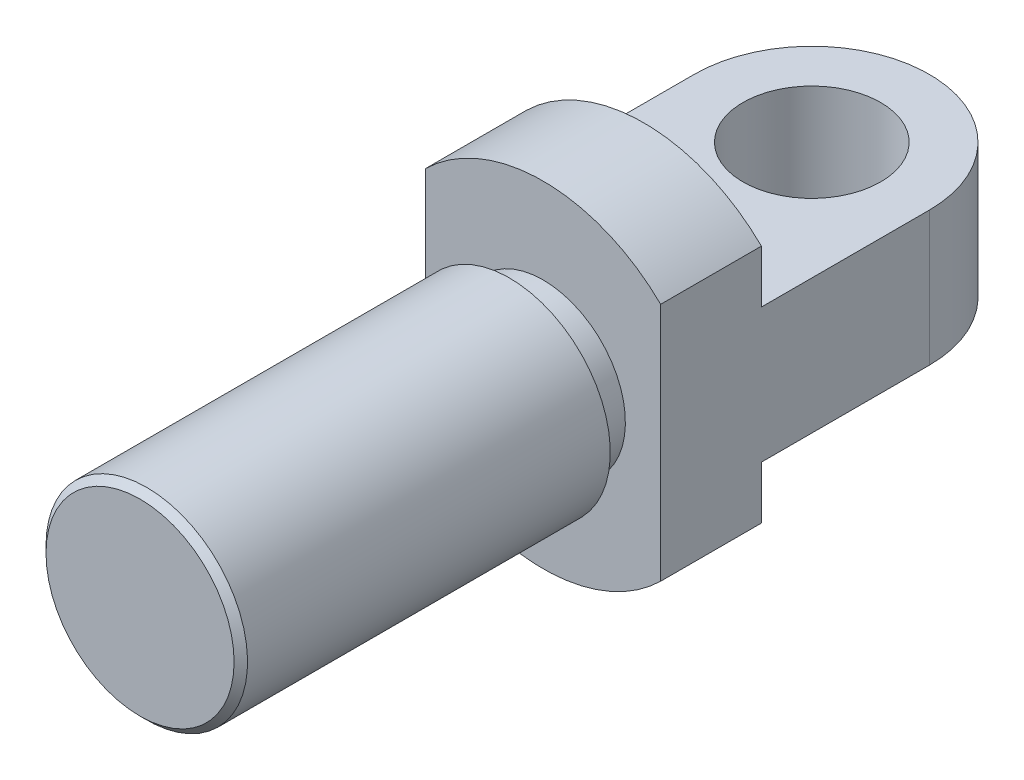
ISO-10303-21;
HEADER;
FILE_DESCRIPTION(('STEP AP214'),'2;1');
FILE_NAME('part.step','',(''),(''),'','','');
FILE_SCHEMA(('AUTOMOTIVE_DESIGN { 1 0 10303 214 1 1 1 1 }'));
ENDSEC;
DATA;
#1=APPLICATION_CONTEXT('core data for automotive mechanical design processes');
#2=APPLICATION_PROTOCOL_DEFINITION('international standard','automotive_design',2000,#1);
#3=PRODUCT_CONTEXT('',#1,'mechanical');
#4=PRODUCT('Part','Part','',(#3));
#5=PRODUCT_RELATED_PRODUCT_CATEGORY('part','',(#4));
#6=PRODUCT_DEFINITION_FORMATION('','',#4);
#7=PRODUCT_DEFINITION_CONTEXT('part definition',#1,'design');
#8=PRODUCT_DEFINITION('design','',#6,#7);
#9=PRODUCT_DEFINITION_SHAPE('','',#8);
#10=(LENGTH_UNIT() NAMED_UNIT(*) SI_UNIT(.MILLI.,.METRE.));
#11=(NAMED_UNIT(*) PLANE_ANGLE_UNIT() SI_UNIT($,.RADIAN.));
#12=(NAMED_UNIT(*) SI_UNIT($,.STERADIAN.) SOLID_ANGLE_UNIT());
#13=UNCERTAINTY_MEASURE_WITH_UNIT(LENGTH_MEASURE(1.E-05),#10,'distance_accuracy_value','');
#14=(GEOMETRIC_REPRESENTATION_CONTEXT(3) GLOBAL_UNCERTAINTY_ASSIGNED_CONTEXT((#13)) GLOBAL_UNIT_ASSIGNED_CONTEXT((#10,
#11,#12)) REPRESENTATION_CONTEXT('',''));
#15=CARTESIAN_POINT('',(0.,0.,0.));
#16=DIRECTION('',(0.,0.,1.));
#17=DIRECTION('',(1.,0.,0.));
#18=AXIS2_PLACEMENT_3D('',#15,#16,#17);
#19=CARTESIAN_POINT('',(0.,-2.,-5.));
#20=DIRECTION('',(0.,-1.,0.));
#21=DIRECTION('',(0.,0.,-1.));
#22=AXIS2_PLACEMENT_3D('',#19,#20,#21);
#23=CYLINDRICAL_SURFACE('',#22,3.5);
#24=CARTESIAN_POINT('',(0.,-2.,-5.));
#25=DIRECTION('',(0.,-1.,0.));
#26=DIRECTION('',(-1.,0.,0.));
#27=AXIS2_PLACEMENT_3D('',#24,#25,#26);
#28=CIRCLE('',#27,3.5);
#29=CARTESIAN_POINT('',(-3.5,-2.,-5.));
#30=VERTEX_POINT('',#29);
#31=CARTESIAN_POINT('',(3.5,-2.,-5.));
#32=VERTEX_POINT('',#31);
#33=EDGE_CURVE('E136',#30,#32,#28,.T.);
#34=ORIENTED_EDGE('',*,*,#33,.F.);
#35=DIRECTION('',(0.,-1.,0.));
#36=VECTOR('',#35,1.);
#37=CARTESIAN_POINT('',(-3.5,2.,-5.));
#38=LINE('',#37,#36);
#39=CARTESIAN_POINT('',(-3.5,2.,-5.));
#40=VERTEX_POINT('',#39);
#41=EDGE_CURVE('E187',#40,#30,#38,.T.);
#42=ORIENTED_EDGE('',*,*,#41,.F.);
#43=CARTESIAN_POINT('',(0.,2.,-5.));
#44=DIRECTION('',(0.,-1.,0.));
#45=DIRECTION('',(-1.,0.,0.));
#46=AXIS2_PLACEMENT_3D('',#43,#44,#45);
#47=CIRCLE('',#46,3.5);
#48=CARTESIAN_POINT('',(3.5,2.,-5.));
#49=VERTEX_POINT('',#48);
#50=EDGE_CURVE('E21',#40,#49,#47,.T.);
#51=ORIENTED_EDGE('',*,*,#50,.T.);
#52=DIRECTION('',(0.,-1.,0.));
#53=VECTOR('',#52,1.);
#54=CARTESIAN_POINT('',(3.5,2.,-5.));
#55=LINE('',#54,#53);
#56=EDGE_CURVE('E208',#49,#32,#55,.T.);
#57=ORIENTED_EDGE('',*,*,#56,.T.);
#58=EDGE_LOOP('',(#34,#42,#51,#57));
#59=FACE_BOUND('',#58,.T.);
#60=ADVANCED_FACE('F17',(#59),#23,.T.);
#61=CARTESIAN_POINT('',(0.,0.,0.));
#62=DIRECTION('',(0.,0.,1.));
#63=DIRECTION('',(1.,0.,0.));
#64=AXIS2_PLACEMENT_3D('',#61,#62,#63);
#65=CYLINDRICAL_SURFACE('',#64,5.);
#66=DIRECTION('',(0.,0.,1.));
#67=VECTOR('',#66,1.);
#68=CARTESIAN_POINT('',(-3.5,3.570714214271,0.));
#69=LINE('',#68,#67);
#70=CARTESIAN_POINT('',(-3.5,3.570714214271,0.));
#71=VERTEX_POINT('',#70);
#72=CARTESIAN_POINT('',(-3.5,3.570714214271,3.));
#73=VERTEX_POINT('',#72);
#74=EDGE_CURVE('E196',#71,#73,#69,.T.);
#75=ORIENTED_EDGE('',*,*,#74,.T.);
#76=CARTESIAN_POINT('',(0.,0.,3.));
#77=DIRECTION('',(0.,0.,1.));
#78=DIRECTION('',(0.7,0.714142842854292,0.));
#79=AXIS2_PLACEMENT_3D('',#76,#77,#78);
#80=CIRCLE('',#79,5.);
#81=CARTESIAN_POINT('',(3.5,3.570714214271,3.));
#82=VERTEX_POINT('',#81);
#83=EDGE_CURVE('E152',#82,#73,#80,.T.);
#84=ORIENTED_EDGE('',*,*,#83,.F.);
#85=DIRECTION('',(0.,0.,1.));
#86=VECTOR('',#85,1.);
#87=CARTESIAN_POINT('',(3.5,3.570714214271,0.));
#88=LINE('',#87,#86);
#89=CARTESIAN_POINT('',(3.5,3.570714214271,0.));
#90=VERTEX_POINT('',#89);
#91=EDGE_CURVE('E266',#90,#82,#88,.T.);
#92=ORIENTED_EDGE('',*,*,#91,.F.);
#93=CARTESIAN_POINT('',(0.,0.,0.));
#94=DIRECTION('',(0.,0.,1.));
#95=DIRECTION('',(0.7,0.714142842854292,0.));
#96=AXIS2_PLACEMENT_3D('',#93,#94,#95);
#97=CIRCLE('',#96,5.);
#98=EDGE_CURVE('E253',#90,#71,#97,.T.);
#99=ORIENTED_EDGE('',*,*,#98,.T.);
#100=EDGE_LOOP('',(#75,#84,#92,#99));
#101=FACE_BOUND('',#100,.T.);
#102=ADVANCED_FACE('F309',(#101),#65,.T.);
#103=CARTESIAN_POINT('',(0.,0.,15.));
#104=DIRECTION('',(0.,0.,1.));
#105=DIRECTION('',(1.,0.,0.));
#106=AXIS2_PLACEMENT_3D('',#103,#104,#105);
#107=PLANE('',#106);
#108=CARTESIAN_POINT('',(0.,0.,15.));
#109=DIRECTION('',(0.,0.,1.));
#110=DIRECTION('',(-1.,0.,0.));
#111=AXIS2_PLACEMENT_3D('',#108,#109,#110);
#112=CIRCLE('',#111,2.8);
#113=CARTESIAN_POINT('',(0.,2.8000000000015,15.0000000000015));
#114=VERTEX_POINT('',#113);
#115=EDGE_CURVE('E11',#114,#114,#112,.T.);
#116=ORIENTED_EDGE('',*,*,#115,.T.);
#117=EDGE_LOOP('',(#116));
#118=FACE_BOUND('',#117,.T.);
#119=ADVANCED_FACE('F357',(#118),#107,.T.);
#120=CARTESIAN_POINT('',(0.,0.,14.90000000011));
#121=DIRECTION('',(0.,0.,-1.));
#122=DIRECTION('',(0.,-1.,0.));
#123=AXIS2_PLACEMENT_3D('',#120,#121,#122);
#124=CONICAL_SURFACE('',#123,2.899999999893,0.785398163397448);
#125=CARTESIAN_POINT('',(0.,0.,14.8));
#126=DIRECTION('',(0.,0.,1.));
#127=DIRECTION('',(1.,0.,0.));
#128=AXIS2_PLACEMENT_3D('',#125,#126,#127);
#129=CIRCLE('',#128,3.);
#130=CARTESIAN_POINT('',(-3.,0.,14.8));
#131=VERTEX_POINT('',#130);
#132=CARTESIAN_POINT('',(0.,3.0000000000015,14.8000000000015));
#133=VERTEX_POINT('',#132);
#134=EDGE_CURVE('E163',#131,#133,#129,.T.);
#135=ORIENTED_EDGE('',*,*,#134,.T.);
#136=DIRECTION('',(0.,-0.707106781186548,0.707106781186548));
#137=VECTOR('',#136,1.);
#138=CARTESIAN_POINT('',(0.,2.899999999893,14.90000000011));
#139=LINE('',#138,#137);
#140=EDGE_CURVE('E28',#133,#114,#139,.T.);
#141=ORIENTED_EDGE('',*,*,#140,.T.);
#142=ORIENTED_EDGE('',*,*,#115,.F.);
#143=ORIENTED_EDGE('',*,*,#140,.F.);
#144=CARTESIAN_POINT('',(0.,0.,14.8));
#145=DIRECTION('',(0.,0.,1.));
#146=DIRECTION('',(1.,0.,0.));
#147=AXIS2_PLACEMENT_3D('',#144,#145,#146);
#148=CIRCLE('',#147,3.);
#149=EDGE_CURVE('E181',#133,#131,#148,.T.);
#150=ORIENTED_EDGE('',*,*,#149,.T.);
#151=EDGE_LOOP('',(#135,#141,#142,#143,#150));
#152=FACE_BOUND('',#151,.T.);
#153=ADVANCED_FACE('F385',(#152),#124,.T.);
#154=CARTESIAN_POINT('',(0.,0.,3.));
#155=DIRECTION('',(0.,0.,1.));
#156=DIRECTION('',(1.,0.,0.));
#157=AXIS2_PLACEMENT_3D('',#154,#155,#156);
#158=CYLINDRICAL_SURFACE('',#157,3.);
#159=ORIENTED_EDGE('',*,*,#134,.F.);
#160=DIRECTION('',(0.,0.,-1.));
#161=VECTOR('',#160,1.);
#162=CARTESIAN_POINT('',(-3.,0.,3.));
#163=LINE('',#162,#161);
#164=CARTESIAN_POINT('',(-3.,0.,4.));
#165=VERTEX_POINT('',#164);
#166=EDGE_CURVE('E229',#131,#165,#163,.T.);
#167=ORIENTED_EDGE('',*,*,#166,.T.);
#168=CARTESIAN_POINT('',(0.,0.,4.));
#169=DIRECTION('',(0.,0.,-1.));
#170=DIRECTION('',(-1.,0.,0.));
#171=AXIS2_PLACEMENT_3D('',#168,#169,#170);
#172=CIRCLE('',#171,3.);
#173=EDGE_CURVE('E157',#165,#165,#172,.T.);
#174=ORIENTED_EDGE('',*,*,#173,.F.);
#175=ORIENTED_EDGE('',*,*,#166,.F.);
#176=ORIENTED_EDGE('',*,*,#149,.F.);
#177=EDGE_LOOP('',(#159,#167,#174,#175,#176));
#178=FACE_BOUND('',#177,.T.);
#179=ADVANCED_FACE('F375',(#178),#158,.T.);
#180=CARTESIAN_POINT('',(0.,0.,4.));
#181=DIRECTION('',(0.,0.,-1.));
#182=DIRECTION('',(0.,-1.,0.));
#183=AXIS2_PLACEMENT_3D('',#180,#181,#182);
#184=PLANE('',#183);
#185=CARTESIAN_POINT('',(0.,0.,4.));
#186=DIRECTION('',(0.,0.,-1.));
#187=DIRECTION('',(0.,1.,0.));
#188=AXIS2_PLACEMENT_3D('',#185,#186,#187);
#189=CIRCLE('',#188,2.45);
#190=CARTESIAN_POINT('',(0.,2.45,4.));
#191=VERTEX_POINT('',#190);
#192=EDGE_CURVE('E95',#191,#191,#189,.T.);
#193=ORIENTED_EDGE('',*,*,#192,.F.);
#194=EDGE_LOOP('',(#193));
#195=FACE_BOUND('',#194,.T.);
#196=ORIENTED_EDGE('',*,*,#173,.T.);
#197=EDGE_LOOP('',(#196));
#198=FACE_BOUND('',#197,.T.);
#199=ADVANCED_FACE('F369',(#195,#198),#184,.T.);
#200=CARTESIAN_POINT('',(0.,0.,4.05));
#201=DIRECTION('',(0.,0.,-1.));
#202=DIRECTION('',(0.,-1.,0.));
#203=AXIS2_PLACEMENT_3D('',#200,#201,#202);
#204=CYLINDRICAL_SURFACE('',#203,2.45);
#205=CARTESIAN_POINT('',(0.,0.,3.));
#206=DIRECTION('',(0.,0.,1.));
#207=DIRECTION('',(0.,1.,0.));
#208=AXIS2_PLACEMENT_3D('',#205,#206,#207);
#209=CIRCLE('',#208,2.45);
#210=CARTESIAN_POINT('',(0.,2.45,3.));
#211=VERTEX_POINT('',#210);
#212=EDGE_CURVE('E150',#211,#211,#209,.T.);
#213=ORIENTED_EDGE('',*,*,#212,.T.);
#214=DIRECTION('',(0.,0.,1.));
#215=VECTOR('',#214,1.);
#216=CARTESIAN_POINT('',(0.,2.45,4.05));
#217=LINE('',#216,#215);
#218=EDGE_CURVE('E103',#211,#191,#217,.T.);
#219=ORIENTED_EDGE('',*,*,#218,.T.);
#220=ORIENTED_EDGE('',*,*,#192,.T.);
#221=ORIENTED_EDGE('',*,*,#218,.F.);
#222=EDGE_LOOP('',(#213,#219,#220,#221));
#223=FACE_BOUND('',#222,.T.);
#224=ADVANCED_FACE('F374',(#223),#204,.T.);
#225=CARTESIAN_POINT('',(0.,0.,3.));
#226=DIRECTION('',(0.,0.,1.));
#227=DIRECTION('',(1.,0.,0.));
#228=AXIS2_PLACEMENT_3D('',#225,#226,#227);
#229=PLANE('',#228);
#230=ORIENTED_EDGE('',*,*,#212,.F.);
#231=EDGE_LOOP('',(#230));
#232=FACE_BOUND('',#231,.T.);
#233=DIRECTION('',(0.,-1.,0.));
#234=VECTOR('',#233,1.);
#235=CARTESIAN_POINT('',(-3.5,3.570714214271,3.));
#236=LINE('',#235,#234);
#237=CARTESIAN_POINT('',(-3.5,-3.570714214271,3.));
#238=VERTEX_POINT('',#237);
#239=EDGE_CURVE('E200',#73,#238,#236,.T.);
#240=ORIENTED_EDGE('',*,*,#239,.T.);
#241=CARTESIAN_POINT('',(0.,0.,3.));
#242=DIRECTION('',(0.,0.,1.));
#243=DIRECTION('',(-0.7,-0.714142842854292,0.));
#244=AXIS2_PLACEMENT_3D('',#241,#242,#243);
#245=CIRCLE('',#244,5.);
#246=CARTESIAN_POINT('',(3.5,-3.570714214271,3.));
#247=VERTEX_POINT('',#246);
#248=EDGE_CURVE('E172',#238,#247,#245,.T.);
#249=ORIENTED_EDGE('',*,*,#248,.T.);
#250=DIRECTION('',(0.,1.,0.));
#251=VECTOR('',#250,1.);
#252=CARTESIAN_POINT('',(3.5,-3.570714214271,3.));
#253=LINE('',#252,#251);
#254=EDGE_CURVE('E263',#247,#82,#253,.T.);
#255=ORIENTED_EDGE('',*,*,#254,.T.);
#256=ORIENTED_EDGE('',*,*,#83,.T.);
#257=EDGE_LOOP('',(#240,#249,#255,#256));
#258=FACE_BOUND('',#257,.T.);
#259=ADVANCED_FACE('F307',(#232,#258),#229,.T.);
#260=CARTESIAN_POINT('',(0.,0.,0.));
#261=DIRECTION('',(0.,0.,1.));
#262=DIRECTION('',(1.,0.,0.));
#263=AXIS2_PLACEMENT_3D('',#260,#261,#262);
#264=CYLINDRICAL_SURFACE('',#263,5.);
#265=DIRECTION('',(0.,0.,1.));
#266=VECTOR('',#265,1.);
#267=CARTESIAN_POINT('',(-3.5,-3.570714214271,0.));
#268=LINE('',#267,#266);
#269=CARTESIAN_POINT('',(-3.5,-3.570714214271,0.));
#270=VERTEX_POINT('',#269);
#271=EDGE_CURVE('E186',#270,#238,#268,.T.);
#272=ORIENTED_EDGE('',*,*,#271,.F.);
#273=CARTESIAN_POINT('',(0.,0.,0.));
#274=DIRECTION('',(0.,0.,1.));
#275=DIRECTION('',(-0.7,-0.714142842854292,0.));
#276=AXIS2_PLACEMENT_3D('',#273,#274,#275);
#277=CIRCLE('',#276,5.);
#278=CARTESIAN_POINT('',(3.5,-3.570714214271,0.));
#279=VERTEX_POINT('',#278);
#280=EDGE_CURVE('E249',#270,#279,#277,.T.);
#281=ORIENTED_EDGE('',*,*,#280,.T.);
#282=DIRECTION('',(0.,0.,1.));
#283=VECTOR('',#282,1.);
#284=CARTESIAN_POINT('',(3.5,-3.570714214271,0.));
#285=LINE('',#284,#283);
#286=EDGE_CURVE('E195',#279,#247,#285,.T.);
#287=ORIENTED_EDGE('',*,*,#286,.T.);
#288=ORIENTED_EDGE('',*,*,#248,.F.);
#289=EDGE_LOOP('',(#272,#281,#287,#288));
#290=FACE_BOUND('',#289,.T.);
#291=ADVANCED_FACE('F305',(#290),#264,.T.);
#292=CARTESIAN_POINT('',(3.5,2.,0.));
#293=DIRECTION('',(1.,0.,0.));
#294=DIRECTION('',(0.,1.,0.));
#295=AXIS2_PLACEMENT_3D('',#292,#293,#294);
#296=PLANE('',#295);
#297=DIRECTION('',(0.,0.,-1.));
#298=VECTOR('',#297,1.);
#299=CARTESIAN_POINT('',(3.5,-2.,0.));
#300=LINE('',#299,#298);
#301=CARTESIAN_POINT('',(3.5,-2.,0.));
#302=VERTEX_POINT('',#301);
#303=EDGE_CURVE('E144',#302,#32,#300,.T.);
#304=ORIENTED_EDGE('',*,*,#303,.T.);
#305=ORIENTED_EDGE('',*,*,#56,.F.);
#306=DIRECTION('',(0.,0.,-1.));
#307=VECTOR('',#306,1.);
#308=CARTESIAN_POINT('',(3.5,2.,0.));
#309=LINE('',#308,#307);
#310=CARTESIAN_POINT('',(3.5,2.,0.));
#311=VERTEX_POINT('',#310);
#312=EDGE_CURVE('E199',#311,#49,#309,.T.);
#313=ORIENTED_EDGE('',*,*,#312,.F.);
#314=DIRECTION('',(0.,1.,0.));
#315=VECTOR('',#314,1.);
#316=CARTESIAN_POINT('',(3.5,2.,0.));
#317=LINE('',#316,#315);
#318=EDGE_CURVE('E167',#311,#90,#317,.T.);
#319=ORIENTED_EDGE('',*,*,#318,.T.);
#320=ORIENTED_EDGE('',*,*,#91,.T.);
#321=ORIENTED_EDGE('',*,*,#254,.F.);
#322=ORIENTED_EDGE('',*,*,#286,.F.);
#323=DIRECTION('',(0.,1.,0.));
#324=VECTOR('',#323,1.);
#325=CARTESIAN_POINT('',(3.5,-3.570714214271,0.));
#326=LINE('',#325,#324);
#327=EDGE_CURVE('E245',#279,#302,#326,.T.);
#328=ORIENTED_EDGE('',*,*,#327,.T.);
#329=EDGE_LOOP('',(#304,#305,#313,#319,#320,#321,#322,#328));
#330=FACE_BOUND('',#329,.T.);
#331=ADVANCED_FACE('F19',(#330),#296,.T.);
#332=CARTESIAN_POINT('',(3.5,-2.,0.));
#333=DIRECTION('',(0.,-1.,0.));
#334=DIRECTION('',(0.,0.,-1.));
#335=AXIS2_PLACEMENT_3D('',#332,#333,#334);
#336=PLANE('',#335);
#337=CARTESIAN_POINT('',(0.,-2.,-5.));
#338=DIRECTION('',(0.,1.,0.));
#339=DIRECTION('',(-1.,0.,0.));
#340=AXIS2_PLACEMENT_3D('',#337,#338,#339);
#341=CIRCLE('',#340,2.05);
#342=CARTESIAN_POINT('',(2.05,-2.,-5.));
#343=VERTEX_POINT('',#342);
#344=EDGE_CURVE('E134',#343,#343,#341,.T.);
#345=ORIENTED_EDGE('',*,*,#344,.T.);
#346=EDGE_LOOP('',(#345));
#347=FACE_BOUND('',#346,.T.);
#348=DIRECTION('',(-1.,0.,0.));
#349=VECTOR('',#348,1.);
#350=CARTESIAN_POINT('',(3.5,-2.,0.));
#351=LINE('',#350,#349);
#352=CARTESIAN_POINT('',(-3.5,-2.,0.));
#353=VERTEX_POINT('',#352);
#354=EDGE_CURVE('E177',#302,#353,#351,.T.);
#355=ORIENTED_EDGE('',*,*,#354,.T.);
#356=DIRECTION('',(0.,0.,-1.));
#357=VECTOR('',#356,1.);
#358=CARTESIAN_POINT('',(-3.5,-2.,0.));
#359=LINE('',#358,#357);
#360=EDGE_CURVE('E182',#353,#30,#359,.T.);
#361=ORIENTED_EDGE('',*,*,#360,.T.);
#362=ORIENTED_EDGE('',*,*,#33,.T.);
#363=ORIENTED_EDGE('',*,*,#303,.F.);
#364=EDGE_LOOP('',(#355,#361,#362,#363));
#365=FACE_BOUND('',#364,.T.);
#366=ADVANCED_FACE('F296',(#347,#365),#336,.T.);
#367=CARTESIAN_POINT('',(0.,-2.,-5.));
#368=DIRECTION('',(0.,1.,0.));
#369=DIRECTION('',(-1.,0.,0.));
#370=AXIS2_PLACEMENT_3D('',#367,#368,#369);
#371=CYLINDRICAL_SURFACE('',#370,2.05);
#372=ORIENTED_EDGE('',*,*,#344,.F.);
#373=DIRECTION('',(0.,1.,0.));
#374=VECTOR('',#373,1.);
#375=CARTESIAN_POINT('',(2.05,-2.,-5.));
#376=LINE('',#375,#374);
#377=CARTESIAN_POINT('',(2.05,2.,-5.));
#378=VERTEX_POINT('',#377);
#379=EDGE_CURVE('E129',#343,#378,#376,.T.);
#380=ORIENTED_EDGE('',*,*,#379,.T.);
#381=CARTESIAN_POINT('',(0.,2.,-5.));
#382=DIRECTION('',(0.,1.,0.));
#383=DIRECTION('',(-1.,0.,0.));
#384=AXIS2_PLACEMENT_3D('',#381,#382,#383);
#385=CIRCLE('',#384,2.05);
#386=EDGE_CURVE('E132',#378,#378,#385,.T.);
#387=ORIENTED_EDGE('',*,*,#386,.T.);
#388=ORIENTED_EDGE('',*,*,#379,.F.);
#389=EDGE_LOOP('',(#372,#380,#387,#388));
#390=FACE_BOUND('',#389,.T.);
#391=ADVANCED_FACE('F130',(#390),#371,.F.);
#392=CARTESIAN_POINT('',(-3.5,2.,0.));
#393=DIRECTION('',(0.,1.,0.));
#394=DIRECTION('',(1.,0.,0.));
#395=AXIS2_PLACEMENT_3D('',#392,#393,#394);
#396=PLANE('',#395);
#397=ORIENTED_EDGE('',*,*,#386,.F.);
#398=EDGE_LOOP('',(#397));
#399=FACE_BOUND('',#398,.T.);
#400=DIRECTION('',(1.,0.,0.));
#401=VECTOR('',#400,1.);
#402=CARTESIAN_POINT('',(-3.5,2.,0.));
#403=LINE('',#402,#401);
#404=CARTESIAN_POINT('',(-3.5,2.,0.));
#405=VERTEX_POINT('',#404);
#406=EDGE_CURVE('E149',#405,#311,#403,.T.);
#407=ORIENTED_EDGE('',*,*,#406,.T.);
#408=ORIENTED_EDGE('',*,*,#312,.T.);
#409=ORIENTED_EDGE('',*,*,#50,.F.);
#410=DIRECTION('',(0.,0.,-1.));
#411=VECTOR('',#410,1.);
#412=CARTESIAN_POINT('',(-3.5,2.,0.));
#413=LINE('',#412,#411);
#414=EDGE_CURVE('E192',#405,#40,#413,.T.);
#415=ORIENTED_EDGE('',*,*,#414,.F.);
#416=EDGE_LOOP('',(#407,#408,#409,#415));
#417=FACE_BOUND('',#416,.T.);
#418=ADVANCED_FACE('F348',(#399,#417),#396,.T.);
#419=CARTESIAN_POINT('',(-3.5,-2.,0.));
#420=DIRECTION('',(-1.,0.,0.));
#421=DIRECTION('',(0.,0.,1.));
#422=AXIS2_PLACEMENT_3D('',#419,#420,#421);
#423=PLANE('',#422);
#424=ORIENTED_EDGE('',*,*,#414,.T.);
#425=ORIENTED_EDGE('',*,*,#41,.T.);
#426=ORIENTED_EDGE('',*,*,#360,.F.);
#427=DIRECTION('',(0.,-1.,0.));
#428=VECTOR('',#427,1.);
#429=CARTESIAN_POINT('',(-3.5,-2.,0.));
#430=LINE('',#429,#428);
#431=EDGE_CURVE('E173',#353,#270,#430,.T.);
#432=ORIENTED_EDGE('',*,*,#431,.T.);
#433=ORIENTED_EDGE('',*,*,#271,.T.);
#434=ORIENTED_EDGE('',*,*,#239,.F.);
#435=ORIENTED_EDGE('',*,*,#74,.F.);
#436=DIRECTION('',(0.,1.,0.));
#437=VECTOR('',#436,1.);
#438=CARTESIAN_POINT('',(-3.5,2.,0.));
#439=LINE('',#438,#437);
#440=EDGE_CURVE('E188',#405,#71,#439,.T.);
#441=ORIENTED_EDGE('',*,*,#440,.F.);
#442=EDGE_LOOP('',(#424,#425,#426,#432,#433,#434,#435,#441));
#443=FACE_BOUND('',#442,.T.);
#444=ADVANCED_FACE('F291',(#443),#423,.T.);
#445=CARTESIAN_POINT('',(0.,0.,0.));
#446=DIRECTION('',(0.,0.,1.));
#447=DIRECTION('',(1.,0.,0.));
#448=AXIS2_PLACEMENT_3D('',#445,#446,#447);
#449=PLANE('',#448);
#450=ORIENTED_EDGE('',*,*,#98,.F.);
#451=ORIENTED_EDGE('',*,*,#318,.F.);
#452=ORIENTED_EDGE('',*,*,#406,.F.);
#453=ORIENTED_EDGE('',*,*,#440,.T.);
#454=EDGE_LOOP('',(#450,#451,#452,#453));
#455=FACE_BOUND('',#454,.T.);
#456=ADVANCED_FACE('F313',(#455),#449,.F.);
#457=CARTESIAN_POINT('',(0.,0.,0.));
#458=DIRECTION('',(0.,0.,1.));
#459=DIRECTION('',(1.,0.,0.));
#460=AXIS2_PLACEMENT_3D('',#457,#458,#459);
#461=PLANE('',#460);
#462=ORIENTED_EDGE('',*,*,#431,.F.);
#463=ORIENTED_EDGE('',*,*,#354,.F.);
#464=ORIENTED_EDGE('',*,*,#327,.F.);
#465=ORIENTED_EDGE('',*,*,#280,.F.);
#466=EDGE_LOOP('',(#462,#463,#464,#465));
#467=FACE_BOUND('',#466,.T.);
#468=ADVANCED_FACE('F302',(#467),#461,.F.);
#469=CLOSED_SHELL('',(#60,#102,#119,#153,#179,#199,#224,#259,#291,#331,#366,#391,#418,#444,#456,#468));
#470=MANIFOLD_SOLID_BREP('B1',#469);
#471=ADVANCED_BREP_SHAPE_REPRESENTATION('',(#18,#470),#14);
#472=SHAPE_DEFINITION_REPRESENTATION(#9,#471);
ENDSEC;
END-ISO-10303-21;
